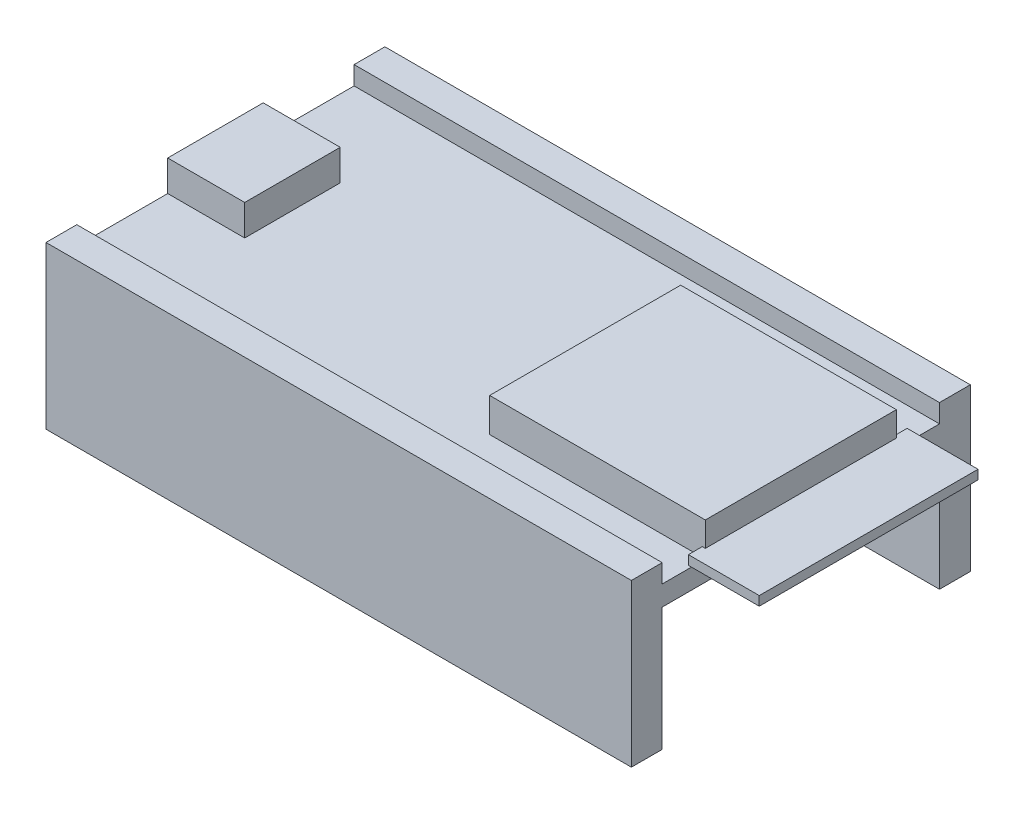
ISO-10303-21;
HEADER;
FILE_DESCRIPTION(('STEP AP214'),'2;1');
FILE_NAME('part.step','',(''),(''),'','','');
FILE_SCHEMA(('AUTOMOTIVE_DESIGN { 1 0 10303 214 1 1 1 1 }'));
ENDSEC;
DATA;
#1=APPLICATION_CONTEXT('core data for automotive mechanical design processes');
#2=APPLICATION_PROTOCOL_DEFINITION('international standard','automotive_design',2000,#1);
#3=PRODUCT_CONTEXT('',#1,'mechanical');
#4=PRODUCT('Part','Part','',(#3));
#5=PRODUCT_RELATED_PRODUCT_CATEGORY('part','',(#4));
#6=PRODUCT_DEFINITION_FORMATION('','',#4);
#7=PRODUCT_DEFINITION_CONTEXT('part definition',#1,'design');
#8=PRODUCT_DEFINITION('design','',#6,#7);
#9=PRODUCT_DEFINITION_SHAPE('','',#8);
#10=(LENGTH_UNIT() NAMED_UNIT(*) SI_UNIT(.MILLI.,.METRE.));
#11=(NAMED_UNIT(*) PLANE_ANGLE_UNIT() SI_UNIT($,.RADIAN.));
#12=(NAMED_UNIT(*) SI_UNIT($,.STERADIAN.) SOLID_ANGLE_UNIT());
#13=UNCERTAINTY_MEASURE_WITH_UNIT(LENGTH_MEASURE(1.E-05),#10,'distance_accuracy_value','');
#14=(GEOMETRIC_REPRESENTATION_CONTEXT(3) GLOBAL_UNCERTAINTY_ASSIGNED_CONTEXT((#13)) GLOBAL_UNIT_ASSIGNED_CONTEXT((#10,
#11,#12)) REPRESENTATION_CONTEXT('',''));
#15=CARTESIAN_POINT('',(0.,0.,0.));
#16=DIRECTION('',(0.,0.,1.));
#17=DIRECTION('',(1.,0.,0.));
#18=AXIS2_PLACEMENT_3D('',#15,#16,#17);
#19=CARTESIAN_POINT('',(0.,1.65099999999999,0.));
#20=DIRECTION('',(0.,1.,0.));
#21=DIRECTION('',(0.,0.,1.));
#22=AXIS2_PLACEMENT_3D('',#19,#20,#21);
#23=PLANE('',#22);
#24=DIRECTION('',(0.,0.,-1.));
#25=VECTOR('',#24,1.);
#26=CARTESIAN_POINT('',(-17.78,1.65099999999999,-3.93699999999999));
#27=LINE('',#26,#25);
#28=CARTESIAN_POINT('',(-17.78,1.65099999999999,3.937));
#29=VERTEX_POINT('',#28);
#30=CARTESIAN_POINT('',(-17.78,1.65099999999999,-3.93699999999999));
#31=VERTEX_POINT('',#30);
#32=EDGE_CURVE('E55',#29,#31,#27,.T.);
#33=ORIENTED_EDGE('',*,*,#32,.F.);
#34=DIRECTION('',(1.,0.,0.));
#35=VECTOR('',#34,1.);
#36=CARTESIAN_POINT('',(-24.13,1.65099999999999,3.937));
#37=LINE('',#36,#35);
#38=CARTESIAN_POINT('',(-24.13,1.65099999999999,3.937));
#39=VERTEX_POINT('',#38);
#40=EDGE_CURVE('E641',#39,#29,#37,.T.);
#41=ORIENTED_EDGE('',*,*,#40,.F.);
#42=DIRECTION('',(0.,0.,1.));
#43=VECTOR('',#42,1.);
#44=CARTESIAN_POINT('',(-24.13,1.65099999999999,-13.97));
#45=LINE('',#44,#43);
#46=CARTESIAN_POINT('',(-24.13,1.65099999999999,11.43));
#47=VERTEX_POINT('',#46);
#48=EDGE_CURVE('E240',#39,#47,#45,.T.);
#49=ORIENTED_EDGE('',*,*,#48,.T.);
#50=DIRECTION('',(-1.,0.,0.));
#51=VECTOR('',#50,1.);
#52=CARTESIAN_POINT('',(0.,1.65099999999999,11.43));
#53=LINE('',#52,#51);
#54=CARTESIAN_POINT('',(24.13,1.65099999999999,11.43));
#55=VERTEX_POINT('',#54);
#56=EDGE_CURVE('E385',#55,#47,#53,.T.);
#57=ORIENTED_EDGE('',*,*,#56,.F.);
#58=DIRECTION('',(0.,0.,-1.));
#59=VECTOR('',#58,1.);
#60=CARTESIAN_POINT('',(24.13,1.65099999999999,-13.97));
#61=LINE('',#60,#59);
#62=CARTESIAN_POINT('',(24.13,1.65099999999999,9.017));
#63=VERTEX_POINT('',#62);
#64=EDGE_CURVE('E389',#55,#63,#61,.T.);
#65=ORIENTED_EDGE('',*,*,#64,.T.);
#66=DIRECTION('',(1.,0.,0.));
#67=VECTOR('',#66,1.);
#68=CARTESIAN_POINT('',(23.876,1.65099999999999,9.017));
#69=LINE('',#68,#67);
#70=CARTESIAN_POINT('',(23.876,1.65099999999999,9.017));
#71=VERTEX_POINT('',#70);
#72=EDGE_CURVE('E282',#71,#63,#69,.T.);
#73=ORIENTED_EDGE('',*,*,#72,.F.);
#74=DIRECTION('',(0.,0.,-1.));
#75=VECTOR('',#74,1.);
#76=CARTESIAN_POINT('',(23.876,1.65099999999999,9.017));
#77=LINE('',#76,#75);
#78=CARTESIAN_POINT('',(23.876,1.65099999999999,7.874));
#79=VERTEX_POINT('',#78);
#80=EDGE_CURVE('E262',#71,#79,#77,.T.);
#81=ORIENTED_EDGE('',*,*,#80,.T.);
#82=DIRECTION('',(1.,0.,0.));
#83=VECTOR('',#82,1.);
#84=CARTESIAN_POINT('',(6.34999999999999,1.65099999999999,7.874));
#85=LINE('',#84,#83);
#86=CARTESIAN_POINT('',(6.34999999999999,1.65099999999999,7.874));
#87=VERTEX_POINT('',#86);
#88=EDGE_CURVE('E298',#87,#79,#85,.T.);
#89=ORIENTED_EDGE('',*,*,#88,.F.);
#90=DIRECTION('',(0.,0.,1.));
#91=VECTOR('',#90,1.);
#92=CARTESIAN_POINT('',(6.34999999999999,1.65099999999999,-7.874));
#93=LINE('',#92,#91);
#94=CARTESIAN_POINT('',(6.34999999999999,1.65099999999999,-7.874));
#95=VERTEX_POINT('',#94);
#96=EDGE_CURVE('E306',#95,#87,#93,.T.);
#97=ORIENTED_EDGE('',*,*,#96,.F.);
#98=DIRECTION('',(-1.,0.,0.));
#99=VECTOR('',#98,1.);
#100=CARTESIAN_POINT('',(6.34999999999999,1.65099999999999,-7.874));
#101=LINE('',#100,#99);
#102=CARTESIAN_POINT('',(23.876,1.65099999999999,-7.874));
#103=VERTEX_POINT('',#102);
#104=EDGE_CURVE('E293',#103,#95,#101,.T.);
#105=ORIENTED_EDGE('',*,*,#104,.F.);
#106=CARTESIAN_POINT('',(23.876,1.65099999999999,-9.017));
#107=VERTEX_POINT('',#106);
#108=EDGE_CURVE('E261',#103,#107,#77,.T.);
#109=ORIENTED_EDGE('',*,*,#108,.T.);
#110=DIRECTION('',(1.,0.,0.));
#111=VECTOR('',#110,1.);
#112=CARTESIAN_POINT('',(23.876,1.65099999999999,-9.017));
#113=LINE('',#112,#111);
#114=CARTESIAN_POINT('',(24.13,1.65099999999999,-9.017));
#115=VERTEX_POINT('',#114);
#116=EDGE_CURVE('E278',#107,#115,#113,.T.);
#117=ORIENTED_EDGE('',*,*,#116,.T.);
#118=CARTESIAN_POINT('',(24.13,1.65099999999999,-11.43));
#119=VERTEX_POINT('',#118);
#120=EDGE_CURVE('E393',#115,#119,#61,.T.);
#121=ORIENTED_EDGE('',*,*,#120,.T.);
#122=DIRECTION('',(-1.,0.,0.));
#123=VECTOR('',#122,1.);
#124=CARTESIAN_POINT('',(0.,1.65099999999999,-11.43));
#125=LINE('',#124,#123);
#126=CARTESIAN_POINT('',(-24.13,1.65099999999999,-11.43));
#127=VERTEX_POINT('',#126);
#128=EDGE_CURVE('E345',#119,#127,#125,.T.);
#129=ORIENTED_EDGE('',*,*,#128,.T.);
#130=CARTESIAN_POINT('',(-24.13,1.65099999999999,-3.937));
#131=VERTEX_POINT('',#130);
#132=EDGE_CURVE('E394',#127,#131,#45,.T.);
#133=ORIENTED_EDGE('',*,*,#132,.T.);
#134=DIRECTION('',(-1.,0.,0.));
#135=VECTOR('',#134,1.);
#136=CARTESIAN_POINT('',(-24.13,1.65099999999999,-3.937));
#137=LINE('',#136,#135);
#138=EDGE_CURVE('E60',#31,#131,#137,.T.);
#139=ORIENTED_EDGE('',*,*,#138,.F.);
#140=EDGE_LOOP('',(#33,#41,#49,#57,#65,#73,#81,#89,#97,#105,#109,#117,#121,#129,#133,#139));
#141=FACE_BOUND('',#140,.T.);
#142=ADVANCED_FACE('F40',(#141),#23,.T.);
#143=CARTESIAN_POINT('',(24.13,1.65099999999999,-13.97));
#144=DIRECTION('',(-1.,0.,0.));
#145=DIRECTION('',(0.,0.,1.));
#146=AXIS2_PLACEMENT_3D('',#143,#144,#145);
#147=PLANE('',#146);
#148=DIRECTION('',(0.,-1.,0.));
#149=VECTOR('',#148,1.);
#150=CARTESIAN_POINT('',(24.13,4.445,7.874));
#151=LINE('',#150,#149);
#152=CARTESIAN_POINT('',(24.13,4.445,7.874));
#153=VERTEX_POINT('',#152);
#154=CARTESIAN_POINT('',(24.13,2.413,7.874));
#155=VERTEX_POINT('',#154);
#156=EDGE_CURVE('E304',#153,#155,#151,.T.);
#157=ORIENTED_EDGE('',*,*,#156,.T.);
#158=DIRECTION('',(0.,0.,-1.));
#159=VECTOR('',#158,1.);
#160=CARTESIAN_POINT('',(24.13,2.413,-13.97));
#161=LINE('',#160,#159);
#162=CARTESIAN_POINT('',(24.13,2.413,-7.874));
#163=VERTEX_POINT('',#162);
#164=EDGE_CURVE('E287',#155,#163,#161,.T.);
#165=ORIENTED_EDGE('',*,*,#164,.T.);
#166=DIRECTION('',(0.,-1.,0.));
#167=VECTOR('',#166,1.);
#168=CARTESIAN_POINT('',(24.13,4.445,-7.874));
#169=LINE('',#168,#167);
#170=CARTESIAN_POINT('',(24.13,4.445,-7.874));
#171=VERTEX_POINT('',#170);
#172=EDGE_CURVE('E319',#171,#163,#169,.T.);
#173=ORIENTED_EDGE('',*,*,#172,.F.);
#174=DIRECTION('',(0.,0.,-1.));
#175=VECTOR('',#174,1.);
#176=CARTESIAN_POINT('',(24.13,4.445,-7.874));
#177=LINE('',#176,#175);
#178=EDGE_CURVE('E294',#153,#171,#177,.T.);
#179=ORIENTED_EDGE('',*,*,#178,.F.);
#180=EDGE_LOOP('',(#157,#165,#173,#179));
#181=FACE_BOUND('',#180,.T.);
#182=ADVANCED_FACE('F449',(#181),#147,.F.);
#183=CARTESIAN_POINT('',(0.,0.,0.));
#184=DIRECTION('',(0.,1.,0.));
#185=DIRECTION('',(0.,0.,1.));
#186=AXIS2_PLACEMENT_3D('',#183,#184,#185);
#187=PLANE('',#186);
#188=DIRECTION('',(-1.,0.,0.));
#189=VECTOR('',#188,1.);
#190=CARTESIAN_POINT('',(0.,0.,-11.43));
#191=LINE('',#190,#189);
#192=CARTESIAN_POINT('',(24.13,0.,-11.43));
#193=VERTEX_POINT('',#192);
#194=CARTESIAN_POINT('',(-24.13,0.,-11.43));
#195=VERTEX_POINT('',#194);
#196=EDGE_CURVE('E411',#193,#195,#191,.T.);
#197=ORIENTED_EDGE('',*,*,#196,.F.);
#198=DIRECTION('',(0.,0.,-1.));
#199=VECTOR('',#198,1.);
#200=CARTESIAN_POINT('',(24.13,0.,-13.97));
#201=LINE('',#200,#199);
#202=CARTESIAN_POINT('',(24.13,0.,11.43));
#203=VERTEX_POINT('',#202);
#204=EDGE_CURVE('E388',#203,#193,#201,.T.);
#205=ORIENTED_EDGE('',*,*,#204,.F.);
#206=DIRECTION('',(-1.,0.,0.));
#207=VECTOR('',#206,1.);
#208=CARTESIAN_POINT('',(0.,0.,11.43));
#209=LINE('',#208,#207);
#210=CARTESIAN_POINT('',(-24.13,0.,11.43));
#211=VERTEX_POINT('',#210);
#212=EDGE_CURVE('E408',#203,#211,#209,.T.);
#213=ORIENTED_EDGE('',*,*,#212,.T.);
#214=DIRECTION('',(0.,0.,1.));
#215=VECTOR('',#214,1.);
#216=CARTESIAN_POINT('',(-24.13,0.,-13.97));
#217=LINE('',#216,#215);
#218=EDGE_CURVE('E399',#195,#211,#217,.T.);
#219=ORIENTED_EDGE('',*,*,#218,.F.);
#220=EDGE_LOOP('',(#197,#205,#213,#219));
#221=FACE_BOUND('',#220,.T.);
#222=ADVANCED_FACE('F476',(#221),#187,.F.);
#223=EDGE_CURVE('E392',#63,#115,#61,.T.);
#224=ORIENTED_EDGE('',*,*,#223,.F.);
#225=ORIENTED_EDGE('',*,*,#64,.F.);
#226=DIRECTION('',(0.,1.,0.));
#227=VECTOR('',#226,1.);
#228=CARTESIAN_POINT('',(24.13,-68.6467958797188,11.43));
#229=LINE('',#228,#227);
#230=CARTESIAN_POINT('',(24.13,3.17500000000001,11.43));
#231=VERTEX_POINT('',#230);
#232=EDGE_CURVE('E367',#55,#231,#229,.T.);
#233=ORIENTED_EDGE('',*,*,#232,.T.);
#234=DIRECTION('',(0.,0.,-1.));
#235=VECTOR('',#234,1.);
#236=CARTESIAN_POINT('',(24.13,3.17500000000001,13.97));
#237=LINE('',#236,#235);
#238=CARTESIAN_POINT('',(24.13,3.17500000000001,13.97));
#239=VERTEX_POINT('',#238);
#240=EDGE_CURVE('E361',#239,#231,#237,.T.);
#241=ORIENTED_EDGE('',*,*,#240,.F.);
#242=DIRECTION('',(0.,-1.,0.));
#243=VECTOR('',#242,1.);
#244=CARTESIAN_POINT('',(24.13,1.65099999999999,13.97));
#245=LINE('',#244,#243);
#246=CARTESIAN_POINT('',(24.13,-10.16,13.97));
#247=VERTEX_POINT('',#246);
#248=EDGE_CURVE('E396',#239,#247,#245,.T.);
#249=ORIENTED_EDGE('',*,*,#248,.T.);
#250=DIRECTION('',(0.,0.,1.));
#251=VECTOR('',#250,1.);
#252=CARTESIAN_POINT('',(24.13,-10.16,13.97));
#253=LINE('',#252,#251);
#254=CARTESIAN_POINT('',(24.13,-10.16,11.43));
#255=VERTEX_POINT('',#254);
#256=EDGE_CURVE('E368',#255,#247,#253,.T.);
#257=ORIENTED_EDGE('',*,*,#256,.F.);
#258=EDGE_CURVE('E380',#255,#203,#229,.T.);
#259=ORIENTED_EDGE('',*,*,#258,.T.);
#260=ORIENTED_EDGE('',*,*,#204,.T.);
#261=DIRECTION('',(0.,1.,0.));
#262=VECTOR('',#261,1.);
#263=CARTESIAN_POINT('',(24.13,-68.6467958797188,-11.43));
#264=LINE('',#263,#262);
#265=CARTESIAN_POINT('',(24.13,-10.16,-11.43));
#266=VERTEX_POINT('',#265);
#267=EDGE_CURVE('E346',#266,#193,#264,.T.);
#268=ORIENTED_EDGE('',*,*,#267,.F.);
#269=DIRECTION('',(0.,0.,-1.));
#270=VECTOR('',#269,1.);
#271=CARTESIAN_POINT('',(24.13,-10.16,-13.97));
#272=LINE('',#271,#270);
#273=CARTESIAN_POINT('',(24.13,-10.16,-13.97));
#274=VERTEX_POINT('',#273);
#275=EDGE_CURVE('E335',#266,#274,#272,.T.);
#276=ORIENTED_EDGE('',*,*,#275,.T.);
#277=DIRECTION('',(0.,-1.,0.));
#278=VECTOR('',#277,1.);
#279=CARTESIAN_POINT('',(24.13,1.65099999999999,-13.97));
#280=LINE('',#279,#278);
#281=CARTESIAN_POINT('',(24.13,3.17500000000001,-13.97));
#282=VERTEX_POINT('',#281);
#283=EDGE_CURVE('E406',#282,#274,#280,.T.);
#284=ORIENTED_EDGE('',*,*,#283,.F.);
#285=DIRECTION('',(0.,0.,1.));
#286=VECTOR('',#285,1.);
#287=CARTESIAN_POINT('',(24.13,3.17500000000001,-13.97));
#288=LINE('',#287,#286);
#289=CARTESIAN_POINT('',(24.13,3.17500000000001,-11.43));
#290=VERTEX_POINT('',#289);
#291=EDGE_CURVE('E328',#282,#290,#288,.T.);
#292=ORIENTED_EDGE('',*,*,#291,.T.);
#293=EDGE_CURVE('E348',#119,#290,#264,.T.);
#294=ORIENTED_EDGE('',*,*,#293,.F.);
#295=ORIENTED_EDGE('',*,*,#120,.F.);
#296=EDGE_LOOP('',(#224,#225,#233,#241,#249,#257,#259,#260,#268,#276,#284,#292,#294,#295));
#297=FACE_BOUND('',#296,.T.);
#298=ADVANCED_FACE('F42',(#297),#147,.F.);
#299=CARTESIAN_POINT('',(-24.13,1.65099999999999,-13.97));
#300=DIRECTION('',(0.,0.,1.));
#301=DIRECTION('',(1.,0.,0.));
#302=AXIS2_PLACEMENT_3D('',#299,#300,#301);
#303=PLANE('',#302);
#304=ORIENTED_EDGE('',*,*,#283,.T.);
#305=DIRECTION('',(-1.,0.,0.));
#306=VECTOR('',#305,1.);
#307=CARTESIAN_POINT('',(-24.13,-10.16,-13.97));
#308=LINE('',#307,#306);
#309=CARTESIAN_POINT('',(-24.13,-10.16,-13.97));
#310=VERTEX_POINT('',#309);
#311=EDGE_CURVE('E338',#274,#310,#308,.T.);
#312=ORIENTED_EDGE('',*,*,#311,.T.);
#313=DIRECTION('',(0.,-1.,0.));
#314=VECTOR('',#313,1.);
#315=CARTESIAN_POINT('',(-24.13,1.65099999999999,-13.97));
#316=LINE('',#315,#314);
#317=CARTESIAN_POINT('',(-24.13,3.17500000000001,-13.97));
#318=VERTEX_POINT('',#317);
#319=EDGE_CURVE('E404',#318,#310,#316,.T.);
#320=ORIENTED_EDGE('',*,*,#319,.F.);
#321=DIRECTION('',(1.,0.,0.));
#322=VECTOR('',#321,1.);
#323=CARTESIAN_POINT('',(-24.13,3.17500000000001,-13.97));
#324=LINE('',#323,#322);
#325=EDGE_CURVE('E331',#318,#282,#324,.T.);
#326=ORIENTED_EDGE('',*,*,#325,.T.);
#327=EDGE_LOOP('',(#304,#312,#320,#326));
#328=FACE_BOUND('',#327,.T.);
#329=ADVANCED_FACE('F490',(#328),#303,.F.);
#330=CARTESIAN_POINT('',(-24.13,1.65099999999999,-13.97));
#331=DIRECTION('',(1.,0.,0.));
#332=DIRECTION('',(0.,0.,-1.));
#333=AXIS2_PLACEMENT_3D('',#330,#331,#332);
#334=PLANE('',#333);
#335=ORIENTED_EDGE('',*,*,#319,.T.);
#336=DIRECTION('',(0.,0.,1.));
#337=VECTOR('',#336,1.);
#338=CARTESIAN_POINT('',(-24.13,-10.16,-13.97));
#339=LINE('',#338,#337);
#340=CARTESIAN_POINT('',(-24.13,-10.16,-11.43));
#341=VERTEX_POINT('',#340);
#342=EDGE_CURVE('E342',#310,#341,#339,.T.);
#343=ORIENTED_EDGE('',*,*,#342,.T.);
#344=DIRECTION('',(0.,1.,0.));
#345=VECTOR('',#344,1.);
#346=CARTESIAN_POINT('',(-24.13,-68.6467958797188,-11.43));
#347=LINE('',#346,#345);
#348=EDGE_CURVE('E349',#341,#195,#347,.T.);
#349=ORIENTED_EDGE('',*,*,#348,.T.);
#350=ORIENTED_EDGE('',*,*,#218,.T.);
#351=DIRECTION('',(0.,1.,0.));
#352=VECTOR('',#351,1.);
#353=CARTESIAN_POINT('',(-24.13,-68.6467958797188,11.43));
#354=LINE('',#353,#352);
#355=CARTESIAN_POINT('',(-24.13,-10.16,11.43));
#356=VERTEX_POINT('',#355);
#357=EDGE_CURVE('E372',#356,#211,#354,.T.);
#358=ORIENTED_EDGE('',*,*,#357,.F.);
#359=DIRECTION('',(0.,0.,-1.));
#360=VECTOR('',#359,1.);
#361=CARTESIAN_POINT('',(-24.13,-10.16,13.97));
#362=LINE('',#361,#360);
#363=CARTESIAN_POINT('',(-24.13,-10.16,13.97));
#364=VERTEX_POINT('',#363);
#365=EDGE_CURVE('E374',#364,#356,#362,.T.);
#366=ORIENTED_EDGE('',*,*,#365,.F.);
#367=DIRECTION('',(0.,-1.,0.));
#368=VECTOR('',#367,1.);
#369=CARTESIAN_POINT('',(-24.13,1.65099999999999,13.97));
#370=LINE('',#369,#368);
#371=CARTESIAN_POINT('',(-24.13,3.17500000000001,13.97));
#372=VERTEX_POINT('',#371);
#373=EDGE_CURVE('E402',#372,#364,#370,.T.);
#374=ORIENTED_EDGE('',*,*,#373,.F.);
#375=DIRECTION('',(0.,0.,1.));
#376=VECTOR('',#375,1.);
#377=CARTESIAN_POINT('',(-24.13,3.17500000000001,13.97));
#378=LINE('',#377,#376);
#379=CARTESIAN_POINT('',(-24.13,3.17500000000001,11.43));
#380=VERTEX_POINT('',#379);
#381=EDGE_CURVE('E355',#380,#372,#378,.T.);
#382=ORIENTED_EDGE('',*,*,#381,.F.);
#383=EDGE_CURVE('E379',#47,#380,#354,.T.);
#384=ORIENTED_EDGE('',*,*,#383,.F.);
#385=ORIENTED_EDGE('',*,*,#48,.F.);
#386=DIRECTION('',(0.,-1.,0.));
#387=VECTOR('',#386,1.);
#388=CARTESIAN_POINT('',(-24.13,4.191,3.937));
#389=LINE('',#388,#387);
#390=CARTESIAN_POINT('',(-24.13,4.191,3.937));
#391=VERTEX_POINT('',#390);
#392=EDGE_CURVE('E222',#391,#39,#389,.T.);
#393=ORIENTED_EDGE('',*,*,#392,.F.);
#394=DIRECTION('',(0.,0.,1.));
#395=VECTOR('',#394,1.);
#396=CARTESIAN_POINT('',(-24.13,4.191,-3.937));
#397=LINE('',#396,#395);
#398=CARTESIAN_POINT('',(-24.13,4.191,-3.937));
#399=VERTEX_POINT('',#398);
#400=EDGE_CURVE('E228',#399,#391,#397,.T.);
#401=ORIENTED_EDGE('',*,*,#400,.F.);
#402=DIRECTION('',(0.,-1.,0.));
#403=VECTOR('',#402,1.);
#404=CARTESIAN_POINT('',(-24.13,4.191,-3.937));
#405=LINE('',#404,#403);
#406=EDGE_CURVE('E634',#399,#131,#405,.T.);
#407=ORIENTED_EDGE('',*,*,#406,.T.);
#408=ORIENTED_EDGE('',*,*,#132,.F.);
#409=CARTESIAN_POINT('',(-24.13,3.17500000000001,-11.43));
#410=VERTEX_POINT('',#409);
#411=EDGE_CURVE('E334',#127,#410,#347,.T.);
#412=ORIENTED_EDGE('',*,*,#411,.T.);
#413=DIRECTION('',(0.,0.,-1.));
#414=VECTOR('',#413,1.);
#415=CARTESIAN_POINT('',(-24.13,3.17500000000001,-13.97));
#416=LINE('',#415,#414);
#417=EDGE_CURVE('E322',#410,#318,#416,.T.);
#418=ORIENTED_EDGE('',*,*,#417,.T.);
#419=EDGE_LOOP('',(#335,#343,#349,#350,#358,#366,#374,#382,#384,#385,#393,#401,#407,#408,#412,#418));
#420=FACE_BOUND('',#419,.T.);
#421=ADVANCED_FACE('F238',(#420),#334,.F.);
#422=CARTESIAN_POINT('',(-24.13,1.65099999999999,13.97));
#423=DIRECTION('',(0.,0.,-1.));
#424=DIRECTION('',(-1.,0.,0.));
#425=AXIS2_PLACEMENT_3D('',#422,#423,#424);
#426=PLANE('',#425);
#427=ORIENTED_EDGE('',*,*,#373,.T.);
#428=DIRECTION('',(-1.,0.,0.));
#429=VECTOR('',#428,1.);
#430=CARTESIAN_POINT('',(-24.13,-10.16,13.97));
#431=LINE('',#430,#429);
#432=EDGE_CURVE('E376',#247,#364,#431,.T.);
#433=ORIENTED_EDGE('',*,*,#432,.F.);
#434=ORIENTED_EDGE('',*,*,#248,.F.);
#435=DIRECTION('',(1.,0.,0.));
#436=VECTOR('',#435,1.);
#437=CARTESIAN_POINT('',(-24.13,3.17500000000001,13.97));
#438=LINE('',#437,#436);
#439=EDGE_CURVE('E358',#372,#239,#438,.T.);
#440=ORIENTED_EDGE('',*,*,#439,.F.);
#441=EDGE_LOOP('',(#427,#433,#434,#440));
#442=FACE_BOUND('',#441,.T.);
#443=ADVANCED_FACE('F484',(#442),#426,.F.);
#444=CARTESIAN_POINT('',(0.,-10.16,0.));
#445=DIRECTION('',(0.,1.,0.));
#446=DIRECTION('',(0.,0.,1.));
#447=AXIS2_PLACEMENT_3D('',#444,#445,#446);
#448=PLANE('',#447);
#449=ORIENTED_EDGE('',*,*,#365,.T.);
#450=DIRECTION('',(1.,0.,0.));
#451=VECTOR('',#450,1.);
#452=CARTESIAN_POINT('',(-24.13,-10.16,11.43));
#453=LINE('',#452,#451);
#454=EDGE_CURVE('E371',#356,#255,#453,.T.);
#455=ORIENTED_EDGE('',*,*,#454,.T.);
#456=ORIENTED_EDGE('',*,*,#256,.T.);
#457=ORIENTED_EDGE('',*,*,#432,.T.);
#458=EDGE_LOOP('',(#449,#455,#456,#457));
#459=FACE_BOUND('',#458,.T.);
#460=ADVANCED_FACE('F487',(#459),#448,.F.);
#461=CARTESIAN_POINT('',(-24.13,-68.6467958797188,11.43));
#462=DIRECTION('',(0.,0.,-1.));
#463=DIRECTION('',(-1.,0.,0.));
#464=AXIS2_PLACEMENT_3D('',#461,#462,#463);
#465=PLANE('',#464);
#466=ORIENTED_EDGE('',*,*,#212,.F.);
#467=ORIENTED_EDGE('',*,*,#258,.F.);
#468=ORIENTED_EDGE('',*,*,#454,.F.);
#469=ORIENTED_EDGE('',*,*,#357,.T.);
#470=EDGE_LOOP('',(#466,#467,#468,#469));
#471=FACE_BOUND('',#470,.T.);
#472=ADVANCED_FACE('F534',(#471),#465,.T.);
#473=ORIENTED_EDGE('',*,*,#232,.F.);
#474=ORIENTED_EDGE('',*,*,#56,.T.);
#475=ORIENTED_EDGE('',*,*,#383,.T.);
#476=DIRECTION('',(-1.,0.,0.));
#477=VECTOR('',#476,1.);
#478=CARTESIAN_POINT('',(-24.13,3.17500000000001,11.43));
#479=LINE('',#478,#477);
#480=EDGE_CURVE('E364',#231,#380,#479,.T.);
#481=ORIENTED_EDGE('',*,*,#480,.F.);
#482=EDGE_LOOP('',(#473,#474,#475,#481));
#483=FACE_BOUND('',#482,.T.);
#484=ADVANCED_FACE('F479',(#483),#465,.T.);
#485=CARTESIAN_POINT('',(0.,3.17500000000001,0.));
#486=DIRECTION('',(0.,-1.,0.));
#487=DIRECTION('',(0.,0.,-1.));
#488=AXIS2_PLACEMENT_3D('',#485,#486,#487);
#489=PLANE('',#488);
#490=ORIENTED_EDGE('',*,*,#381,.T.);
#491=ORIENTED_EDGE('',*,*,#439,.T.);
#492=ORIENTED_EDGE('',*,*,#240,.T.);
#493=ORIENTED_EDGE('',*,*,#480,.T.);
#494=EDGE_LOOP('',(#490,#491,#492,#493));
#495=FACE_BOUND('',#494,.T.);
#496=ADVANCED_FACE('F524',(#495),#489,.F.);
#497=CARTESIAN_POINT('',(0.,-10.16,0.));
#498=DIRECTION('',(0.,1.,0.));
#499=DIRECTION('',(0.,0.,1.));
#500=AXIS2_PLACEMENT_3D('',#497,#498,#499);
#501=PLANE('',#500);
#502=ORIENTED_EDGE('',*,*,#311,.F.);
#503=ORIENTED_EDGE('',*,*,#275,.F.);
#504=DIRECTION('',(1.,0.,0.));
#505=VECTOR('',#504,1.);
#506=CARTESIAN_POINT('',(-24.13,-10.16,-11.43));
#507=LINE('',#506,#505);
#508=EDGE_CURVE('E339',#341,#266,#507,.T.);
#509=ORIENTED_EDGE('',*,*,#508,.F.);
#510=ORIENTED_EDGE('',*,*,#342,.F.);
#511=EDGE_LOOP('',(#502,#503,#509,#510));
#512=FACE_BOUND('',#511,.T.);
#513=ADVANCED_FACE('F502',(#512),#501,.F.);
#514=CARTESIAN_POINT('',(-24.13,-68.6467958797188,-11.43));
#515=DIRECTION('',(0.,0.,-1.));
#516=DIRECTION('',(-1.,0.,0.));
#517=AXIS2_PLACEMENT_3D('',#514,#515,#516);
#518=PLANE('',#517);
#519=ORIENTED_EDGE('',*,*,#267,.T.);
#520=ORIENTED_EDGE('',*,*,#196,.T.);
#521=ORIENTED_EDGE('',*,*,#348,.F.);
#522=ORIENTED_EDGE('',*,*,#508,.T.);
#523=EDGE_LOOP('',(#519,#520,#521,#522));
#524=FACE_BOUND('',#523,.T.);
#525=ADVANCED_FACE('F508',(#524),#518,.F.);
#526=ORIENTED_EDGE('',*,*,#128,.F.);
#527=ORIENTED_EDGE('',*,*,#293,.T.);
#528=DIRECTION('',(-1.,0.,0.));
#529=VECTOR('',#528,1.);
#530=CARTESIAN_POINT('',(-24.13,3.17500000000001,-11.43));
#531=LINE('',#530,#529);
#532=EDGE_CURVE('E325',#290,#410,#531,.T.);
#533=ORIENTED_EDGE('',*,*,#532,.T.);
#534=ORIENTED_EDGE('',*,*,#411,.F.);
#535=EDGE_LOOP('',(#526,#527,#533,#534));
#536=FACE_BOUND('',#535,.T.);
#537=ADVANCED_FACE('F517',(#536),#518,.F.);
#538=CARTESIAN_POINT('',(0.,3.17500000000001,0.));
#539=DIRECTION('',(0.,-1.,0.));
#540=DIRECTION('',(0.,0.,1.));
#541=AXIS2_PLACEMENT_3D('',#538,#539,#540);
#542=PLANE('',#541);
#543=ORIENTED_EDGE('',*,*,#417,.F.);
#544=ORIENTED_EDGE('',*,*,#532,.F.);
#545=ORIENTED_EDGE('',*,*,#291,.F.);
#546=ORIENTED_EDGE('',*,*,#325,.F.);
#547=EDGE_LOOP('',(#543,#544,#545,#546));
#548=FACE_BOUND('',#547,.T.);
#549=ADVANCED_FACE('F513',(#548),#542,.F.);
#550=CARTESIAN_POINT('',(6.34999999999999,4.445,-7.874));
#551=DIRECTION('',(0.,0.,1.));
#552=DIRECTION('',(1.,0.,0.));
#553=AXIS2_PLACEMENT_3D('',#550,#551,#552);
#554=PLANE('',#553);
#555=ORIENTED_EDGE('',*,*,#172,.T.);
#556=DIRECTION('',(-1.,0.,0.));
#557=VECTOR('',#556,1.);
#558=CARTESIAN_POINT('',(6.34999999999999,2.413,-7.874));
#559=LINE('',#558,#557);
#560=CARTESIAN_POINT('',(23.876,2.413,-7.874));
#561=VERTEX_POINT('',#560);
#562=EDGE_CURVE('E290',#163,#561,#559,.T.);
#563=ORIENTED_EDGE('',*,*,#562,.T.);
#564=DIRECTION('',(0.,-1.,0.));
#565=VECTOR('',#564,1.);
#566=CARTESIAN_POINT('',(23.876,4.445,-7.874));
#567=LINE('',#566,#565);
#568=EDGE_CURVE('E275',#561,#103,#567,.T.);
#569=ORIENTED_EDGE('',*,*,#568,.T.);
#570=ORIENTED_EDGE('',*,*,#104,.T.);
#571=DIRECTION('',(0.,-1.,0.));
#572=VECTOR('',#571,1.);
#573=CARTESIAN_POINT('',(6.34999999999999,4.445,-7.874));
#574=LINE('',#573,#572);
#575=CARTESIAN_POINT('',(6.34999999999999,4.445,-7.874));
#576=VERTEX_POINT('',#575);
#577=EDGE_CURVE('E316',#576,#95,#574,.T.);
#578=ORIENTED_EDGE('',*,*,#577,.F.);
#579=DIRECTION('',(-1.,0.,0.));
#580=VECTOR('',#579,1.);
#581=CARTESIAN_POINT('',(6.34999999999999,4.445,-7.874));
#582=LINE('',#581,#580);
#583=EDGE_CURVE('E297',#171,#576,#582,.T.);
#584=ORIENTED_EDGE('',*,*,#583,.F.);
#585=EDGE_LOOP('',(#555,#563,#569,#570,#578,#584));
#586=FACE_BOUND('',#585,.T.);
#587=ADVANCED_FACE('F443',(#586),#554,.F.);
#588=CARTESIAN_POINT('',(6.34999999999999,4.445,-7.874));
#589=DIRECTION('',(1.,0.,0.));
#590=DIRECTION('',(0.,0.,-1.));
#591=AXIS2_PLACEMENT_3D('',#588,#589,#590);
#592=PLANE('',#591);
#593=ORIENTED_EDGE('',*,*,#96,.T.);
#594=DIRECTION('',(0.,-1.,0.));
#595=VECTOR('',#594,1.);
#596=CARTESIAN_POINT('',(6.34999999999999,4.445,7.874));
#597=LINE('',#596,#595);
#598=CARTESIAN_POINT('',(6.34999999999999,4.445,7.874));
#599=VERTEX_POINT('',#598);
#600=EDGE_CURVE('E313',#599,#87,#597,.T.);
#601=ORIENTED_EDGE('',*,*,#600,.F.);
#602=DIRECTION('',(0.,0.,1.));
#603=VECTOR('',#602,1.);
#604=CARTESIAN_POINT('',(6.34999999999999,4.445,-7.874));
#605=LINE('',#604,#603);
#606=EDGE_CURVE('E300',#576,#599,#605,.T.);
#607=ORIENTED_EDGE('',*,*,#606,.F.);
#608=ORIENTED_EDGE('',*,*,#577,.T.);
#609=EDGE_LOOP('',(#593,#601,#607,#608));
#610=FACE_BOUND('',#609,.T.);
#611=ADVANCED_FACE('F456',(#610),#592,.F.);
#612=CARTESIAN_POINT('',(6.34999999999999,4.445,7.874));
#613=DIRECTION('',(0.,0.,-1.));
#614=DIRECTION('',(-1.,0.,0.));
#615=AXIS2_PLACEMENT_3D('',#612,#613,#614);
#616=PLANE('',#615);
#617=DIRECTION('',(0.,1.,0.));
#618=VECTOR('',#617,1.);
#619=CARTESIAN_POINT('',(23.876,4.445,7.874));
#620=LINE('',#619,#618);
#621=CARTESIAN_POINT('',(23.876,2.413,7.874));
#622=VERTEX_POINT('',#621);
#623=EDGE_CURVE('E48',#79,#622,#620,.T.);
#624=ORIENTED_EDGE('',*,*,#623,.T.);
#625=DIRECTION('',(1.,0.,0.));
#626=VECTOR('',#625,1.);
#627=CARTESIAN_POINT('',(6.34999999999999,2.413,7.874));
#628=LINE('',#627,#626);
#629=EDGE_CURVE('E12',#622,#155,#628,.T.);
#630=ORIENTED_EDGE('',*,*,#629,.T.);
#631=ORIENTED_EDGE('',*,*,#156,.F.);
#632=DIRECTION('',(1.,0.,0.));
#633=VECTOR('',#632,1.);
#634=CARTESIAN_POINT('',(6.34999999999999,4.445,7.874));
#635=LINE('',#634,#633);
#636=EDGE_CURVE('E302',#599,#153,#635,.T.);
#637=ORIENTED_EDGE('',*,*,#636,.F.);
#638=ORIENTED_EDGE('',*,*,#600,.T.);
#639=ORIENTED_EDGE('',*,*,#88,.T.);
#640=EDGE_LOOP('',(#624,#630,#631,#637,#638,#639));
#641=FACE_BOUND('',#640,.T.);
#642=ADVANCED_FACE('F415',(#641),#616,.F.);
#643=CARTESIAN_POINT('',(0.,4.445,0.));
#644=DIRECTION('',(0.,1.,0.));
#645=DIRECTION('',(0.,0.,1.));
#646=AXIS2_PLACEMENT_3D('',#643,#644,#645);
#647=PLANE('',#646);
#648=ORIENTED_EDGE('',*,*,#178,.T.);
#649=ORIENTED_EDGE('',*,*,#583,.T.);
#650=ORIENTED_EDGE('',*,*,#606,.T.);
#651=ORIENTED_EDGE('',*,*,#636,.T.);
#652=EDGE_LOOP('',(#648,#649,#650,#651));
#653=FACE_BOUND('',#652,.T.);
#654=ADVANCED_FACE('F453',(#653),#647,.T.);
#655=CARTESIAN_POINT('',(23.876,2.413,9.017));
#656=DIRECTION('',(0.,1.,0.));
#657=DIRECTION('',(0.,0.,1.));
#658=AXIS2_PLACEMENT_3D('',#655,#656,#657);
#659=PLANE('',#658);
#660=ORIENTED_EDGE('',*,*,#562,.F.);
#661=ORIENTED_EDGE('',*,*,#164,.F.);
#662=ORIENTED_EDGE('',*,*,#629,.F.);
#663=DIRECTION('',(0.,0.,1.));
#664=VECTOR('',#663,1.);
#665=CARTESIAN_POINT('',(23.876,2.413,9.017));
#666=LINE('',#665,#664);
#667=CARTESIAN_POINT('',(23.876,2.413,9.017));
#668=VERTEX_POINT('',#667);
#669=EDGE_CURVE('E268',#622,#668,#666,.T.);
#670=ORIENTED_EDGE('',*,*,#669,.T.);
#671=DIRECTION('',(1.,0.,0.));
#672=VECTOR('',#671,1.);
#673=CARTESIAN_POINT('',(23.876,2.413,9.017));
#674=LINE('',#673,#672);
#675=CARTESIAN_POINT('',(29.718,2.413,9.017));
#676=VERTEX_POINT('',#675);
#677=EDGE_CURVE('E273',#668,#676,#674,.T.);
#678=ORIENTED_EDGE('',*,*,#677,.T.);
#679=DIRECTION('',(0.,0.,1.));
#680=VECTOR('',#679,1.);
#681=CARTESIAN_POINT('',(29.718,2.413,9.017));
#682=LINE('',#681,#680);
#683=CARTESIAN_POINT('',(29.718,2.413,-9.017));
#684=VERTEX_POINT('',#683);
#685=EDGE_CURVE('E255',#684,#676,#682,.T.);
#686=ORIENTED_EDGE('',*,*,#685,.F.);
#687=DIRECTION('',(1.,0.,0.));
#688=VECTOR('',#687,1.);
#689=CARTESIAN_POINT('',(23.876,2.413,-9.017));
#690=LINE('',#689,#688);
#691=CARTESIAN_POINT('',(23.876,2.413,-9.017));
#692=VERTEX_POINT('',#691);
#693=EDGE_CURVE('E276',#692,#684,#690,.T.);
#694=ORIENTED_EDGE('',*,*,#693,.F.);
#695=EDGE_CURVE('E269',#692,#561,#666,.T.);
#696=ORIENTED_EDGE('',*,*,#695,.T.);
#697=EDGE_LOOP('',(#660,#661,#662,#670,#678,#686,#694,#696));
#698=FACE_BOUND('',#697,.T.);
#699=ADVANCED_FACE('F432',(#698),#659,.T.);
#700=CARTESIAN_POINT('',(23.876,1.65099999999999,9.017));
#701=DIRECTION('',(0.,-1.,0.));
#702=DIRECTION('',(0.,0.,-1.));
#703=AXIS2_PLACEMENT_3D('',#700,#701,#702);
#704=PLANE('',#703);
#705=ORIENTED_EDGE('',*,*,#223,.T.);
#706=CARTESIAN_POINT('',(29.718,1.65099999999999,-9.017));
#707=VERTEX_POINT('',#706);
#708=EDGE_CURVE('E281',#115,#707,#113,.T.);
#709=ORIENTED_EDGE('',*,*,#708,.T.);
#710=DIRECTION('',(0.,0.,-1.));
#711=VECTOR('',#710,1.);
#712=CARTESIAN_POINT('',(29.718,1.65099999999999,9.017));
#713=LINE('',#712,#711);
#714=CARTESIAN_POINT('',(29.718,1.65099999999999,9.017));
#715=VERTEX_POINT('',#714);
#716=EDGE_CURVE('E244',#715,#707,#713,.T.);
#717=ORIENTED_EDGE('',*,*,#716,.F.);
#718=EDGE_CURVE('E272',#63,#715,#69,.T.);
#719=ORIENTED_EDGE('',*,*,#718,.F.);
#720=EDGE_LOOP('',(#705,#709,#717,#719));
#721=FACE_BOUND('',#720,.T.);
#722=ADVANCED_FACE('F461',(#721),#704,.T.);
#723=CARTESIAN_POINT('',(23.876,0.,0.));
#724=DIRECTION('',(-1.,0.,0.));
#725=DIRECTION('',(0.,0.,1.));
#726=AXIS2_PLACEMENT_3D('',#723,#724,#725);
#727=PLANE('',#726);
#728=ORIENTED_EDGE('',*,*,#568,.F.);
#729=ORIENTED_EDGE('',*,*,#695,.F.);
#730=DIRECTION('',(0.,1.,0.));
#731=VECTOR('',#730,1.);
#732=CARTESIAN_POINT('',(23.876,1.65099999999999,-9.017));
#733=LINE('',#732,#731);
#734=EDGE_CURVE('E265',#107,#692,#733,.T.);
#735=ORIENTED_EDGE('',*,*,#734,.F.);
#736=ORIENTED_EDGE('',*,*,#108,.F.);
#737=EDGE_LOOP('',(#728,#729,#735,#736));
#738=FACE_BOUND('',#737,.T.);
#739=ADVANCED_FACE('F459',(#738),#727,.T.);
#740=ORIENTED_EDGE('',*,*,#623,.F.);
#741=ORIENTED_EDGE('',*,*,#80,.F.);
#742=DIRECTION('',(0.,-1.,0.));
#743=VECTOR('',#742,1.);
#744=CARTESIAN_POINT('',(23.876,1.65099999999999,9.017));
#745=LINE('',#744,#743);
#746=EDGE_CURVE('E258',#668,#71,#745,.T.);
#747=ORIENTED_EDGE('',*,*,#746,.F.);
#748=ORIENTED_EDGE('',*,*,#669,.F.);
#749=EDGE_LOOP('',(#740,#741,#747,#748));
#750=FACE_BOUND('',#749,.T.);
#751=ADVANCED_FACE('F419',(#750),#727,.T.);
#752=CARTESIAN_POINT('',(23.876,1.65099999999999,9.017));
#753=DIRECTION('',(0.,0.,1.));
#754=DIRECTION('',(1.,0.,0.));
#755=AXIS2_PLACEMENT_3D('',#752,#753,#754);
#756=PLANE('',#755);
#757=ORIENTED_EDGE('',*,*,#72,.T.);
#758=ORIENTED_EDGE('',*,*,#718,.T.);
#759=DIRECTION('',(0.,-1.,0.));
#760=VECTOR('',#759,1.);
#761=CARTESIAN_POINT('',(29.718,1.65099999999999,9.017));
#762=LINE('',#761,#760);
#763=EDGE_CURVE('E241',#676,#715,#762,.T.);
#764=ORIENTED_EDGE('',*,*,#763,.F.);
#765=ORIENTED_EDGE('',*,*,#677,.F.);
#766=ORIENTED_EDGE('',*,*,#746,.T.);
#767=EDGE_LOOP('',(#757,#758,#764,#765,#766));
#768=FACE_BOUND('',#767,.T.);
#769=ADVANCED_FACE('F425',(#768),#756,.T.);
#770=CARTESIAN_POINT('',(23.876,1.65099999999999,-9.017));
#771=DIRECTION('',(0.,0.,-1.));
#772=DIRECTION('',(-1.,0.,0.));
#773=AXIS2_PLACEMENT_3D('',#770,#771,#772);
#774=PLANE('',#773);
#775=ORIENTED_EDGE('',*,*,#693,.T.);
#776=DIRECTION('',(0.,1.,0.));
#777=VECTOR('',#776,1.);
#778=CARTESIAN_POINT('',(29.718,1.65099999999999,-9.017));
#779=LINE('',#778,#777);
#780=EDGE_CURVE('E252',#707,#684,#779,.T.);
#781=ORIENTED_EDGE('',*,*,#780,.F.);
#782=ORIENTED_EDGE('',*,*,#708,.F.);
#783=ORIENTED_EDGE('',*,*,#116,.F.);
#784=ORIENTED_EDGE('',*,*,#734,.T.);
#785=EDGE_LOOP('',(#775,#781,#782,#783,#784));
#786=FACE_BOUND('',#785,.T.);
#787=ADVANCED_FACE('F438',(#786),#774,.T.);
#788=CARTESIAN_POINT('',(29.718,0.,0.));
#789=DIRECTION('',(-1.,0.,0.));
#790=DIRECTION('',(0.,0.,1.));
#791=AXIS2_PLACEMENT_3D('',#788,#789,#790);
#792=PLANE('',#791);
#793=ORIENTED_EDGE('',*,*,#763,.T.);
#794=ORIENTED_EDGE('',*,*,#716,.T.);
#795=ORIENTED_EDGE('',*,*,#780,.T.);
#796=ORIENTED_EDGE('',*,*,#685,.T.);
#797=EDGE_LOOP('',(#793,#794,#795,#796));
#798=FACE_BOUND('',#797,.T.);
#799=ADVANCED_FACE('F434',(#798),#792,.F.);
#800=CARTESIAN_POINT('',(-24.13,4.191,3.937));
#801=DIRECTION('',(0.,0.,-1.));
#802=DIRECTION('',(-1.,0.,0.));
#803=AXIS2_PLACEMENT_3D('',#800,#801,#802);
#804=PLANE('',#803);
#805=ORIENTED_EDGE('',*,*,#40,.T.);
#806=DIRECTION('',(0.,-1.,0.));
#807=VECTOR('',#806,1.);
#808=CARTESIAN_POINT('',(-17.78,4.191,3.937));
#809=LINE('',#808,#807);
#810=CARTESIAN_POINT('',(-17.78,4.191,3.937));
#811=VERTEX_POINT('',#810);
#812=EDGE_CURVE('E224',#811,#29,#809,.T.);
#813=ORIENTED_EDGE('',*,*,#812,.F.);
#814=DIRECTION('',(1.,0.,0.));
#815=VECTOR('',#814,1.);
#816=CARTESIAN_POINT('',(-24.13,4.191,3.937));
#817=LINE('',#816,#815);
#818=EDGE_CURVE('E218',#391,#811,#817,.T.);
#819=ORIENTED_EDGE('',*,*,#818,.F.);
#820=ORIENTED_EDGE('',*,*,#392,.T.);
#821=EDGE_LOOP('',(#805,#813,#819,#820));
#822=FACE_BOUND('',#821,.T.);
#823=ADVANCED_FACE('F220',(#822),#804,.F.);
#824=CARTESIAN_POINT('',(-17.78,4.191,-3.93699999999999));
#825=DIRECTION('',(-1.,0.,0.));
#826=DIRECTION('',(0.,0.,1.));
#827=AXIS2_PLACEMENT_3D('',#824,#825,#826);
#828=PLANE('',#827);
#829=ORIENTED_EDGE('',*,*,#32,.T.);
#830=DIRECTION('',(0.,-1.,0.));
#831=VECTOR('',#830,1.);
#832=CARTESIAN_POINT('',(-17.78,4.191,-3.93699999999999));
#833=LINE('',#832,#831);
#834=CARTESIAN_POINT('',(-17.78,4.191,-3.93699999999999));
#835=VERTEX_POINT('',#834);
#836=EDGE_CURVE('E246',#835,#31,#833,.T.);
#837=ORIENTED_EDGE('',*,*,#836,.F.);
#838=DIRECTION('',(0.,0.,-1.));
#839=VECTOR('',#838,1.);
#840=CARTESIAN_POINT('',(-17.78,4.191,-3.93699999999999));
#841=LINE('',#840,#839);
#842=EDGE_CURVE('E227',#811,#835,#841,.T.);
#843=ORIENTED_EDGE('',*,*,#842,.F.);
#844=ORIENTED_EDGE('',*,*,#812,.T.);
#845=EDGE_LOOP('',(#829,#837,#843,#844));
#846=FACE_BOUND('',#845,.T.);
#847=ADVANCED_FACE('F610',(#846),#828,.F.);
#848=CARTESIAN_POINT('',(-24.13,4.191,-3.937));
#849=DIRECTION('',(0.,0.,1.));
#850=DIRECTION('',(1.,0.,0.));
#851=AXIS2_PLACEMENT_3D('',#848,#849,#850);
#852=PLANE('',#851);
#853=ORIENTED_EDGE('',*,*,#138,.T.);
#854=ORIENTED_EDGE('',*,*,#406,.F.);
#855=DIRECTION('',(-1.,0.,0.));
#856=VECTOR('',#855,1.);
#857=CARTESIAN_POINT('',(-24.13,4.191,-3.937));
#858=LINE('',#857,#856);
#859=EDGE_CURVE('E233',#835,#399,#858,.T.);
#860=ORIENTED_EDGE('',*,*,#859,.F.);
#861=ORIENTED_EDGE('',*,*,#836,.T.);
#862=EDGE_LOOP('',(#853,#854,#860,#861));
#863=FACE_BOUND('',#862,.T.);
#864=ADVANCED_FACE('F617',(#863),#852,.F.);
#865=CARTESIAN_POINT('',(0.,4.191,0.));
#866=DIRECTION('',(0.,1.,0.));
#867=DIRECTION('',(0.,0.,1.));
#868=AXIS2_PLACEMENT_3D('',#865,#866,#867);
#869=PLANE('',#868);
#870=ORIENTED_EDGE('',*,*,#400,.T.);
#871=ORIENTED_EDGE('',*,*,#818,.T.);
#872=ORIENTED_EDGE('',*,*,#842,.T.);
#873=ORIENTED_EDGE('',*,*,#859,.T.);
#874=EDGE_LOOP('',(#870,#871,#872,#873));
#875=FACE_BOUND('',#874,.T.);
#876=ADVANCED_FACE('F231',(#875),#869,.T.);
#877=CLOSED_SHELL('',(#142,#182,#222,#298,#329,#421,#443,#460,#472,#484,#496,#513,#525,#537,
#549,#587,#611,#642,#654,#699,#722,#739,#751,#769,#787,#799,#823,#847,#864,#876));
#878=MANIFOLD_SOLID_BREP('B2',#877);
#879=ADVANCED_BREP_SHAPE_REPRESENTATION('',(#18,#878),#14);
#880=SHAPE_DEFINITION_REPRESENTATION(#9,#879);
ENDSEC;
END-ISO-10303-21;
